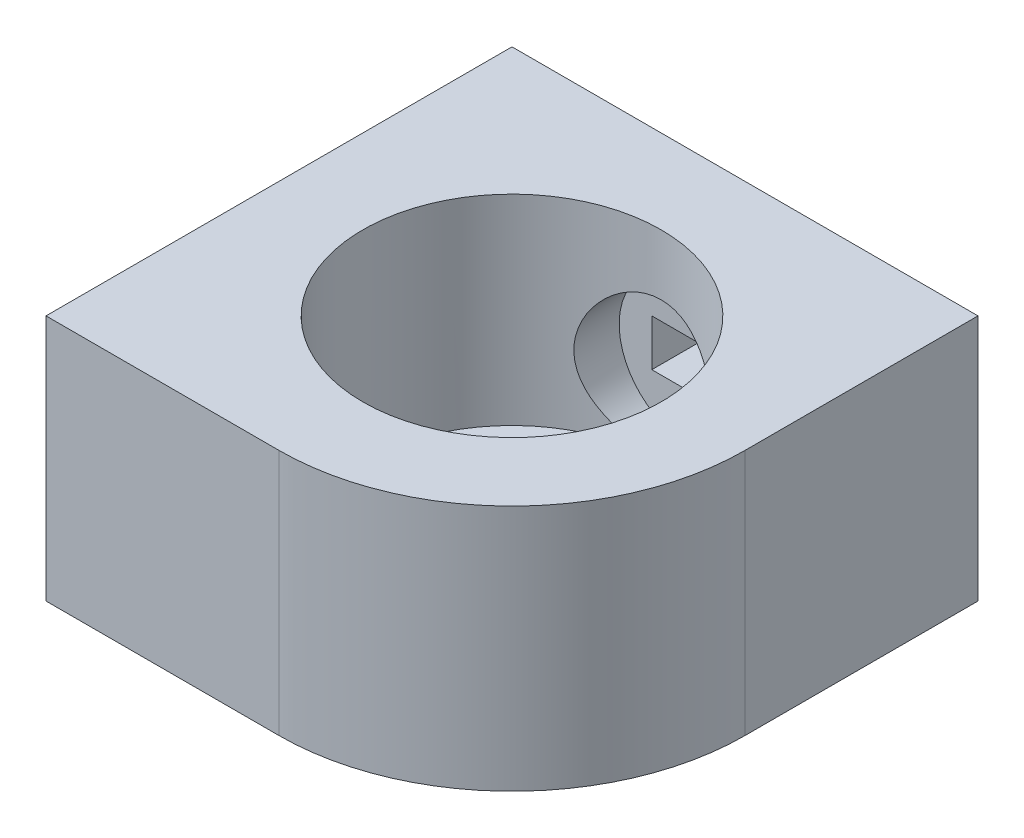
ISO-10303-21;
HEADER;
FILE_DESCRIPTION(('STEP AP214'),'2;1');
FILE_NAME('part.step','',(''),(''),'','','');
FILE_SCHEMA(('AUTOMOTIVE_DESIGN { 1 0 10303 214 1 1 1 1 }'));
ENDSEC;
DATA;
#1=APPLICATION_CONTEXT('core data for automotive mechanical design processes');
#2=APPLICATION_PROTOCOL_DEFINITION('international standard','automotive_design',2000,#1);
#3=PRODUCT_CONTEXT('',#1,'mechanical');
#4=PRODUCT('Part','Part','',(#3));
#5=PRODUCT_RELATED_PRODUCT_CATEGORY('part','',(#4));
#6=PRODUCT_DEFINITION_FORMATION('','',#4);
#7=PRODUCT_DEFINITION_CONTEXT('part definition',#1,'design');
#8=PRODUCT_DEFINITION('design','',#6,#7);
#9=PRODUCT_DEFINITION_SHAPE('','',#8);
#10=(LENGTH_UNIT() NAMED_UNIT(*) SI_UNIT(.MILLI.,.METRE.));
#11=(NAMED_UNIT(*) PLANE_ANGLE_UNIT() SI_UNIT($,.RADIAN.));
#12=(NAMED_UNIT(*) SI_UNIT($,.STERADIAN.) SOLID_ANGLE_UNIT());
#13=UNCERTAINTY_MEASURE_WITH_UNIT(LENGTH_MEASURE(1.E-05),#10,'distance_accuracy_value','');
#14=(GEOMETRIC_REPRESENTATION_CONTEXT(3) GLOBAL_UNCERTAINTY_ASSIGNED_CONTEXT((#13)) GLOBAL_UNIT_ASSIGNED_CONTEXT((#10,
#11,#12)) REPRESENTATION_CONTEXT('',''));
#15=CARTESIAN_POINT('',(0.,0.,0.));
#16=DIRECTION('',(0.,0.,1.));
#17=DIRECTION('',(1.,0.,0.));
#18=AXIS2_PLACEMENT_3D('',#15,#16,#17);
#19=CARTESIAN_POINT('',(0.,26.5,0.));
#20=DIRECTION('',(0.,-1.,0.));
#21=DIRECTION('',(0.,0.,-1.));
#22=AXIS2_PLACEMENT_3D('',#19,#20,#21);
#23=CYLINDRICAL_SURFACE('',#22,25.);
#24=CARTESIAN_POINT('',(0.,0.,0.));
#25=DIRECTION('',(0.,1.,0.));
#26=DIRECTION('',(0.,0.,1.));
#27=AXIS2_PLACEMENT_3D('',#24,#25,#26);
#28=CIRCLE('',#27,25.);
#29=CARTESIAN_POINT('',(0.,0.,25.));
#30=VERTEX_POINT('',#29);
#31=CARTESIAN_POINT('',(25.,0.,0.));
#32=VERTEX_POINT('',#31);
#33=EDGE_CURVE('E224',#30,#32,#28,.T.);
#34=ORIENTED_EDGE('',*,*,#33,.T.);
#35=DIRECTION('',(0.,-1.,0.));
#36=VECTOR('',#35,1.);
#37=CARTESIAN_POINT('',(25.,26.5,0.));
#38=LINE('',#37,#36);
#39=CARTESIAN_POINT('',(25.,26.5,0.));
#40=VERTEX_POINT('',#39);
#41=EDGE_CURVE('E227',#40,#32,#38,.T.);
#42=ORIENTED_EDGE('',*,*,#41,.F.);
#43=CARTESIAN_POINT('',(0.,26.5,0.));
#44=DIRECTION('',(0.,1.,0.));
#45=DIRECTION('',(0.,0.,1.));
#46=AXIS2_PLACEMENT_3D('',#43,#44,#45);
#47=CIRCLE('',#46,25.);
#48=CARTESIAN_POINT('',(0.,26.5,25.));
#49=VERTEX_POINT('',#48);
#50=EDGE_CURVE('E293',#49,#40,#47,.T.);
#51=ORIENTED_EDGE('',*,*,#50,.F.);
#52=DIRECTION('',(0.,-1.,0.));
#53=VECTOR('',#52,1.);
#54=CARTESIAN_POINT('',(0.,26.5,25.));
#55=LINE('',#54,#53);
#56=EDGE_CURVE('E229',#49,#30,#55,.T.);
#57=ORIENTED_EDGE('',*,*,#56,.T.);
#58=EDGE_LOOP('',(#34,#42,#51,#57));
#59=FACE_BOUND('',#58,.T.);
#60=ADVANCED_FACE('F45',(#59),#23,.T.);
#61=CARTESIAN_POINT('',(25.,26.5,0.));
#62=DIRECTION('',(1.,0.,0.));
#63=DIRECTION('',(0.,0.,-1.));
#64=AXIS2_PLACEMENT_3D('',#61,#62,#63);
#65=PLANE('',#64);
#66=DIRECTION('',(0.,0.,1.));
#67=VECTOR('',#66,1.);
#68=CARTESIAN_POINT('',(25.,0.,0.));
#69=LINE('',#68,#67);
#70=CARTESIAN_POINT('',(25.,0.,-25.));
#71=VERTEX_POINT('',#70);
#72=EDGE_CURVE('E234',#71,#32,#69,.T.);
#73=ORIENTED_EDGE('',*,*,#72,.F.);
#74=DIRECTION('',(0.,-1.,0.));
#75=VECTOR('',#74,1.);
#76=CARTESIAN_POINT('',(25.,26.5,-25.));
#77=LINE('',#76,#75);
#78=CARTESIAN_POINT('',(25.,26.5,-25.));
#79=VERTEX_POINT('',#78);
#80=EDGE_CURVE('E265',#79,#71,#77,.T.);
#81=ORIENTED_EDGE('',*,*,#80,.F.);
#82=DIRECTION('',(0.,0.,1.));
#83=VECTOR('',#82,1.);
#84=CARTESIAN_POINT('',(25.,26.5,0.));
#85=LINE('',#84,#83);
#86=EDGE_CURVE('E290',#79,#40,#85,.T.);
#87=ORIENTED_EDGE('',*,*,#86,.T.);
#88=ORIENTED_EDGE('',*,*,#41,.T.);
#89=EDGE_LOOP('',(#73,#81,#87,#88));
#90=FACE_BOUND('',#89,.T.);
#91=ADVANCED_FACE('F213',(#90),#65,.T.);
#92=CARTESIAN_POINT('',(0.,26.5,-25.));
#93=DIRECTION('',(0.,0.,-1.));
#94=DIRECTION('',(-1.,0.,0.));
#95=AXIS2_PLACEMENT_3D('',#92,#93,#94);
#96=PLANE('',#95);
#97=DIRECTION('',(0.,-1.,0.));
#98=VECTOR('',#97,1.);
#99=CARTESIAN_POINT('',(4.,26.5,-25.));
#100=LINE('',#99,#98);
#101=CARTESIAN_POINT('',(4.,15.,-25.));
#102=VERTEX_POINT('',#101);
#103=CARTESIAN_POINT('',(4.,10.,-25.));
#104=VERTEX_POINT('',#103);
#105=EDGE_CURVE('E11',#102,#104,#100,.T.);
#106=ORIENTED_EDGE('',*,*,#105,.F.);
#107=DIRECTION('',(1.,0.,0.));
#108=VECTOR('',#107,1.);
#109=CARTESIAN_POINT('',(0.,15.,-25.));
#110=LINE('',#109,#108);
#111=CARTESIAN_POINT('',(-4.,15.,-25.));
#112=VERTEX_POINT('',#111);
#113=EDGE_CURVE('E125',#112,#102,#110,.T.);
#114=ORIENTED_EDGE('',*,*,#113,.F.);
#115=DIRECTION('',(0.,1.,0.));
#116=VECTOR('',#115,1.);
#117=CARTESIAN_POINT('',(-4.,26.5,-25.));
#118=LINE('',#117,#116);
#119=CARTESIAN_POINT('',(-4.,10.,-25.));
#120=VERTEX_POINT('',#119);
#121=EDGE_CURVE('E276',#120,#112,#118,.T.);
#122=ORIENTED_EDGE('',*,*,#121,.F.);
#123=DIRECTION('',(-1.,0.,0.));
#124=VECTOR('',#123,1.);
#125=CARTESIAN_POINT('',(0.,10.,-25.));
#126=LINE('',#125,#124);
#127=EDGE_CURVE('E55',#104,#120,#126,.T.);
#128=ORIENTED_EDGE('',*,*,#127,.F.);
#129=EDGE_LOOP('',(#106,#114,#122,#128));
#130=FACE_BOUND('',#129,.T.);
#131=DIRECTION('',(1.,0.,0.));
#132=VECTOR('',#131,1.);
#133=CARTESIAN_POINT('',(0.,0.,-25.));
#134=LINE('',#133,#132);
#135=CARTESIAN_POINT('',(-25.,0.,-25.));
#136=VERTEX_POINT('',#135);
#137=EDGE_CURVE('E241',#136,#71,#134,.T.);
#138=ORIENTED_EDGE('',*,*,#137,.F.);
#139=DIRECTION('',(0.,-1.,0.));
#140=VECTOR('',#139,1.);
#141=CARTESIAN_POINT('',(-25.,26.5,-25.));
#142=LINE('',#141,#140);
#143=CARTESIAN_POINT('',(-25.,26.5,-25.));
#144=VERTEX_POINT('',#143);
#145=EDGE_CURVE('E262',#144,#136,#142,.T.);
#146=ORIENTED_EDGE('',*,*,#145,.F.);
#147=DIRECTION('',(1.,0.,0.));
#148=VECTOR('',#147,1.);
#149=CARTESIAN_POINT('',(0.,26.5,-25.));
#150=LINE('',#149,#148);
#151=EDGE_CURVE('E288',#144,#79,#150,.T.);
#152=ORIENTED_EDGE('',*,*,#151,.T.);
#153=ORIENTED_EDGE('',*,*,#80,.T.);
#154=EDGE_LOOP('',(#138,#146,#152,#153));
#155=FACE_BOUND('',#154,.T.);
#156=ADVANCED_FACE('F209',(#130,#155),#96,.T.);
#157=CARTESIAN_POINT('',(-25.,26.5,0.));
#158=DIRECTION('',(1.,0.,0.));
#159=DIRECTION('',(0.,0.,-1.));
#160=AXIS2_PLACEMENT_3D('',#157,#158,#159);
#161=PLANE('',#160);
#162=CARTESIAN_POINT('',(-25.,15.,0.));
#163=DIRECTION('',(-1.,0.,0.));
#164=DIRECTION('',(0.,0.,1.));
#165=AXIS2_PLACEMENT_3D('',#162,#163,#164);
#166=CIRCLE('',#165,2.55);
#167=CARTESIAN_POINT('',(-25.,15.,2.55));
#168=VERTEX_POINT('',#167);
#169=EDGE_CURVE('E168',#168,#168,#166,.T.);
#170=ORIENTED_EDGE('',*,*,#169,.F.);
#171=EDGE_LOOP('',(#170));
#172=FACE_BOUND('',#171,.T.);
#173=DIRECTION('',(0.,0.,1.));
#174=VECTOR('',#173,1.);
#175=CARTESIAN_POINT('',(-25.,0.,0.));
#176=LINE('',#175,#174);
#177=CARTESIAN_POINT('',(-25.,0.,25.));
#178=VERTEX_POINT('',#177);
#179=EDGE_CURVE('E245',#136,#178,#176,.T.);
#180=ORIENTED_EDGE('',*,*,#179,.T.);
#181=DIRECTION('',(0.,-1.,0.));
#182=VECTOR('',#181,1.);
#183=CARTESIAN_POINT('',(-25.,26.5,25.));
#184=LINE('',#183,#182);
#185=CARTESIAN_POINT('',(-25.,26.5,25.));
#186=VERTEX_POINT('',#185);
#187=EDGE_CURVE('E258',#186,#178,#184,.T.);
#188=ORIENTED_EDGE('',*,*,#187,.F.);
#189=DIRECTION('',(0.,0.,1.));
#190=VECTOR('',#189,1.);
#191=CARTESIAN_POINT('',(-25.,26.5,0.));
#192=LINE('',#191,#190);
#193=EDGE_CURVE('E298',#144,#186,#192,.T.);
#194=ORIENTED_EDGE('',*,*,#193,.F.);
#195=ORIENTED_EDGE('',*,*,#145,.T.);
#196=EDGE_LOOP('',(#180,#188,#194,#195));
#197=FACE_BOUND('',#196,.T.);
#198=ADVANCED_FACE('F206',(#172,#197),#161,.F.);
#199=CARTESIAN_POINT('',(0.,26.5,0.));
#200=DIRECTION('',(0.,-1.,0.));
#201=DIRECTION('',(0.,0.,-1.));
#202=AXIS2_PLACEMENT_3D('',#199,#200,#201);
#203=CYLINDRICAL_SURFACE('',#202,16.);
#204=CARTESIAN_POINT('',(0.,5.,0.));
#205=DIRECTION('',(0.,1.,0.));
#206=DIRECTION('',(0.,0.,1.));
#207=AXIS2_PLACEMENT_3D('',#204,#205,#206);
#208=CIRCLE('',#207,16.);
#209=CARTESIAN_POINT('',(0.,5.,-16.));
#210=VERTEX_POINT('',#209);
#211=EDGE_CURVE('E270',#210,#210,#208,.T.);
#212=ORIENTED_EDGE('',*,*,#211,.F.);
#213=CARTESIAN_POINT('',(0.,5.,-16.));
#214=CARTESIAN_POINT('',(0.198684978383708,5.00000133470156,-15.9999988460729));
#215=CARTESIAN_POINT('',(0.397405159506662,5.00790498937616,-15.9962898274929));
#216=CARTESIAN_POINT('',(0.793400942144659,5.03943702443244,-15.9815459475786));
#217=CARTESIAN_POINT('',(0.990675748558021,5.06307348606126,-15.9705073213562));
#218=CARTESIAN_POINT('',(1.38255568709545,5.12585725243969,-15.9413677841698));
#219=CARTESIAN_POINT('',(1.57715573407772,5.16503074904217,-15.923254948514));
#220=CARTESIAN_POINT('',(1.96202937856628,5.25847554537294,-15.8804267369559));
#221=CARTESIAN_POINT('',(2.15230117133312,5.31275302251288,-15.8557086597253));
#222=CARTESIAN_POINT('',(2.5263963430627,5.43558776768147,-15.8004090770488));
#223=CARTESIAN_POINT('',(2.7102432870351,5.50408459441996,-15.7698524316229));
#224=CARTESIAN_POINT('',(3.07128036340189,5.6548899995516,-15.7035329009397));
#225=CARTESIAN_POINT('',(3.24846793263279,5.73720383074645,-15.6677680363648));
#226=CARTESIAN_POINT('',(3.59505167550219,5.91490347424538,-15.5918903016855));
#227=CARTESIAN_POINT('',(3.76445252513566,6.01028130083434,-15.5517800908973));
#228=CARTESIAN_POINT('',(4.0947614575028,6.21346120320908,-15.4680966918296));
#229=CARTESIAN_POINT('',(4.25566640913768,6.32126781357084,-15.4245222414517));
#230=CARTESIAN_POINT('',(4.74156081488829,6.6747464942295,-15.2851193948765));
#231=CARTESIAN_POINT('',(5.05078627782166,6.9408061903006,-15.1848958698577));
#232=CARTESIAN_POINT('',(5.62207153793716,7.51926467332938,-14.9828038505899));
#233=CARTESIAN_POINT('',(5.88409999381398,7.83169400288141,-14.880934311862));
#234=CARTESIAN_POINT('',(6.24512338342805,8.3411924792818,-14.7314953708042));
#235=CARTESIAN_POINT('',(6.36315781139047,8.52410197020838,-14.6807602413845));
#236=CARTESIAN_POINT('',(6.58327002412669,8.90027882502379,-14.5833817469594));
#237=CARTESIAN_POINT('',(6.68535444665198,9.09354183498645,-14.5367366833983));
#238=CARTESIAN_POINT('',(6.87264982698682,9.48925315698424,-14.4491309094692));
#239=CARTESIAN_POINT('',(6.95786521609918,9.69169903956227,-14.4081687071264));
#240=CARTESIAN_POINT('',(7.11054360778505,10.1044684143595,-14.3334365571153));
#241=CARTESIAN_POINT('',(7.17800832776723,10.314791142229,-14.2996659137112));
#242=CARTESIAN_POINT('',(7.29107295220363,10.7297265334233,-14.2423329622815));
#243=CARTESIAN_POINT('',(7.33768649732503,10.9339984141371,-14.2183045417657));
#244=CARTESIAN_POINT('',(7.41373780413886,11.3465382051588,-14.1787988507063));
#245=CARTESIAN_POINT('',(7.44317621865973,11.5548059632722,-14.1633212551462));
#246=CARTESIAN_POINT('',(7.4844449105051,11.973417068694,-14.1415569007441));
#247=CARTESIAN_POINT('',(7.49628712066956,12.1837589119344,-14.1352639134251));
#248=CARTESIAN_POINT('',(7.50222194138465,12.6047560606178,-14.1321152706661));
#249=CARTESIAN_POINT('',(7.49631590780841,12.815411340887,-14.1352588943183));
#250=CARTESIAN_POINT('',(7.4683591847244,13.2136459083658,-14.1500465849328));
#251=CARTESIAN_POINT('',(7.44802112924433,13.4013821922175,-14.1607885647231));
#252=CARTESIAN_POINT('',(7.39335102490061,13.7743182890583,-14.1894084821447));
#253=CARTESIAN_POINT('',(7.35901427544551,13.959517228426,-14.2072888167068));
#254=CARTESIAN_POINT('',(7.27673015248413,14.3260550260998,-14.2496081512079));
#255=CARTESIAN_POINT('',(7.22878524329657,14.5073945769217,-14.2740459636012));
#256=CARTESIAN_POINT('',(7.11973671519658,14.8652382243252,-14.3287496621749));
#257=CARTESIAN_POINT('',(7.05862796473205,15.0417404048626,-14.359017820663));
#258=CARTESIAN_POINT('',(6.92226595782545,15.3928362156327,-14.4252592735024));
#259=CARTESIAN_POINT('',(6.84672338987839,15.5672958162029,-14.4613463708806));
#260=CARTESIAN_POINT('',(6.68301435722466,15.9092925218971,-14.5377259676581));
#261=CARTESIAN_POINT('',(6.59484366991334,16.0768272872436,-14.5780198725078));
#262=CARTESIAN_POINT('',(6.40647498952891,16.4041962468056,-14.6617768627162));
#263=CARTESIAN_POINT('',(6.30627493817616,16.564029116616,-14.7052404899281));
#264=CARTESIAN_POINT('',(6.09443533093958,16.8753064509593,-14.7942914525017));
#265=CARTESIAN_POINT('',(5.98279496409667,17.0267503196549,-14.8398789382904));
#266=CARTESIAN_POINT('',(5.73576038327544,17.3367899494433,-14.937220494941));
#267=CARTESIAN_POINT('',(5.59910402609406,17.494342192968,-14.9891016128366));
#268=CARTESIAN_POINT('',(5.31319126171736,17.7974900808866,-15.0928167361417));
#269=CARTESIAN_POINT('',(5.16393821723144,17.9430888959248,-15.1446507504143));
#270=CARTESIAN_POINT('',(4.85345036427314,18.2216737986565,-15.2469916216883));
#271=CARTESIAN_POINT('',(4.69220683181821,18.3546505395025,-15.2974974754636));
#272=CARTESIAN_POINT('',(4.3587257803499,18.6069805724052,-15.3958343550306));
#273=CARTESIAN_POINT('',(4.18649266397653,18.7263392673434,-15.4436664377568));
#274=CARTESIAN_POINT('',(3.82534897437882,18.9547668668391,-15.5371411424123));
#275=CARTESIAN_POINT('',(3.63605782899515,19.0632950529125,-15.5826382921659));
#276=CARTESIAN_POINT('',(3.247829788707,19.2638235884181,-15.6681551582731));
#277=CARTESIAN_POINT('',(3.04889722184982,19.35583126824,-15.7081773020802));
#278=CARTESIAN_POINT('',(2.64273954513623,19.5223988400337,-15.7815872413646));
#279=CARTESIAN_POINT('',(2.43551714256241,19.5969643746364,-15.8149771818675));
#280=CARTESIAN_POINT('',(2.01431837496808,19.727803123287,-15.8741213201554));
#281=CARTESIAN_POINT('',(1.80034268327319,19.7840781546783,-15.8998762765294));
#282=CARTESIAN_POINT('',(1.3838416342024,19.8740680546083,-15.9413115085215));
#283=CARTESIAN_POINT('',(1.1816760670069,19.9091685086244,-15.9576069653574));
#284=CARTESIAN_POINT('',(0.774682525815466,19.9627063246666,-15.9825348793092));
#285=CARTESIAN_POINT('',(0.569854685606537,19.981144520761,-15.991167719995));
#286=CARTESIAN_POINT('',(0.159265388623443,20.0011244636554,-16.0005247004508));
#287=CARTESIAN_POINT('',(-0.0464957330168185,20.0026718590077,-16.0012514841317));
#288=CARTESIAN_POINT('',(-0.457320832895425,19.9888647156134,-15.994782158623));
#289=CARTESIAN_POINT('',(-0.662384834944512,19.9735107600858,-15.987586322821));
#290=CARTESIAN_POINT('',(-1.05657624474016,19.9276756949274,-15.966213997459));
#291=CARTESIAN_POINT('',(-1.24585675746878,19.8982681889996,-15.9525334270816));
#292=CARTESIAN_POINT('',(-1.62113071196638,19.8251954949838,-15.9187762864131));
#293=CARTESIAN_POINT('',(-1.80712300301925,19.7815254158782,-15.8986975220678));
#294=CARTESIAN_POINT('',(-2.17449381590771,19.68038066569,-15.8526288678564));
#295=CARTESIAN_POINT('',(-2.35587375707316,19.6229102995533,-15.8266408215019));
#296=CARTESIAN_POINT('',(-2.71306993562593,19.4946606617722,-15.7693369264515));
#297=CARTESIAN_POINT('',(-2.8888839800483,19.4238762187827,-15.7380190080216));
#298=CARTESIAN_POINT('',(-3.23912592194566,19.2672715481848,-15.6697431345515));
#299=CARTESIAN_POINT('',(-3.41335209461966,19.181062234352,-15.6326435655726));
#300=CARTESIAN_POINT('',(-3.75394929679052,18.995803507234,-15.5543696093481));
#301=CARTESIAN_POINT('',(-3.92031762818516,18.896749726719,-15.5131938372899));
#302=CARTESIAN_POINT('',(-4.24436986100939,18.6864882590567,-15.4276833030028));
#303=CARTESIAN_POINT('',(-4.40205220331746,18.5752784005346,-15.3833479768937));
#304=CARTESIAN_POINT('',(-4.70800134309142,18.3413874243619,-15.2924881874709));
#305=CARTESIAN_POINT('',(-4.8562675287667,18.218705562625,-15.2459635822556));
#306=CARTESIAN_POINT('',(-5.15545198362046,17.9511539982813,-15.1475497207123));
#307=CARTESIAN_POINT('',(-5.30543871289511,17.8052814522686,-15.0955506936582));
#308=CARTESIAN_POINT('',(-5.59266039605666,17.5015820770988,-14.991513566763));
#309=CARTESIAN_POINT('',(-5.72989888883985,17.343758587726,-14.9394754818322));
#310=CARTESIAN_POINT('',(-5.99099156137099,17.0168357879838,-14.8367016916039));
#311=CARTESIAN_POINT('',(-6.11483773955027,16.8477298331184,-14.7859667785691));
#312=CARTESIAN_POINT('',(-6.34828789069091,16.4991557852131,-14.6872498685437));
#313=CARTESIAN_POINT('',(-6.45788996752596,16.3196863172007,-14.6392682385347));
#314=CARTESIAN_POINT('',(-6.66546985674085,15.9451245423081,-14.5459581877502));
#315=CARTESIAN_POINT('',(-6.76293178369181,15.7497096280189,-14.5007735713545));
#316=CARTESIAN_POINT('',(-6.94080032576569,15.3501039993575,-14.416482976866));
#317=CARTESIAN_POINT('',(-7.02121506267237,15.1459175200353,-14.3773741064922));
#318=CARTESIAN_POINT('',(-7.16410018214971,14.7302317223504,-14.3067126210842));
#319=CARTESIAN_POINT('',(-7.22658268879367,14.5187374537265,-14.2751549030884));
#320=CARTESIAN_POINT('',(-7.33284831121284,14.0899976377978,-14.2208618179412));
#321=CARTESIAN_POINT('',(-7.37663387603153,13.8727528476939,-14.1981252953696));
#322=CARTESIAN_POINT('',(-7.44177052488512,13.4543254002257,-14.1640837962867));
#323=CARTESIAN_POINT('',(-7.46479499917719,13.2534711131606,-14.1519296332854));
#324=CARTESIAN_POINT('',(-7.49454494489792,12.8502265079046,-14.1361977073943));
#325=CARTESIAN_POINT('',(-7.50127144771227,12.6478362877255,-14.1326194017981));
#326=CARTESIAN_POINT('',(-7.49833322871385,12.243262143296,-14.1341784280198));
#327=CARTESIAN_POINT('',(-7.48867258798825,12.0410781802257,-14.1393135898183));
#328=CARTESIAN_POINT('',(-7.45310170827637,11.6385503267369,-14.1580958480198));
#329=CARTESIAN_POINT('',(-7.42719187157108,11.4382063908894,-14.1717427336982));
#330=CARTESIAN_POINT('',(-7.36199567648757,11.0557697777293,-14.2057120812356));
#331=CARTESIAN_POINT('',(-7.32385012562808,10.8734296439382,-14.2254612413866));
#332=CARTESIAN_POINT('',(-7.23432363159499,10.51276670086,-14.2711978059801));
#333=CARTESIAN_POINT('',(-7.18293821445399,10.3344452717529,-14.2971873189373));
#334=CARTESIAN_POINT('',(-7.06742914896321,9.98292405647278,-14.3546368818265));
#335=CARTESIAN_POINT('',(-7.00330739008241,9.80972351497644,-14.3860961202245));
#336=CARTESIAN_POINT('',(-6.86282289946018,9.46922493819935,-14.4536408895681));
#337=CARTESIAN_POINT('',(-6.7864554485788,9.30192920891339,-14.4897282029637));
#338=CARTESIAN_POINT('',(-6.61660733291926,8.96323192032883,-14.5681096966101));
#339=CARTESIAN_POINT('',(-6.52232973832439,8.79228840875854,-14.610656357192));
#340=CARTESIAN_POINT('',(-6.32111720794214,8.45878453351891,-14.6988279531691));
#341=CARTESIAN_POINT('',(-6.21417794253295,8.29622706487129,-14.7444539392242));
#342=CARTESIAN_POINT('',(-5.98827132182057,7.98022824541952,-14.8376391569387));
#343=CARTESIAN_POINT('',(-5.86930123732465,7.82678897566983,-14.8851988257846));
#344=CARTESIAN_POINT('',(-5.61996391618704,7.52972689084175,-14.9811164178737));
#345=CARTESIAN_POINT('',(-5.48959596172181,7.38610469504678,-15.0294743912372));
#346=CARTESIAN_POINT('',(-5.20422446267076,7.09521695120401,-15.1308044337945));
#347=CARTESIAN_POINT('',(-5.04806429358375,6.94907215234134,-15.1837444079016));
#348=CARTESIAN_POINT('',(-4.723538845546,6.67042820593642,-15.2878123638838));
#349=CARTESIAN_POINT('',(-4.5551773908853,6.53792481397137,-15.3389409061053));
#350=CARTESIAN_POINT('',(-4.20694413357842,6.28729689554179,-15.4380834206248));
#351=CARTESIAN_POINT('',(-4.02706172440493,6.16918591809874,-15.4860944385284));
#352=CARTESIAN_POINT('',(-3.65703813436837,5.9484769735082,-15.5776240989416));
#353=CARTESIAN_POINT('',(-3.46690174450895,5.84587184526873,-15.6211448122516));
#354=CARTESIAN_POINT('',(-3.0782828220304,5.65744116065697,-15.7023377481207));
#355=CARTESIAN_POINT('',(-2.87983796781283,5.57154810989802,-15.7400333636279));
#356=CARTESIAN_POINT('',(-2.47533267155923,5.416951347954,-15.8086931946041));
#357=CARTESIAN_POINT('',(-2.26927599167237,5.34823927214714,-15.8396606847197));
#358=CARTESIAN_POINT('',(-1.85152677736764,5.22889746235288,-15.8939017494539));
#359=CARTESIAN_POINT('',(-1.63984848047463,5.17822600368025,-15.9171930682654));
#360=CARTESIAN_POINT('',(-1.21226253273045,5.09542133106038,-15.9554513597475));
#361=CARTESIAN_POINT('',(-0.996357766954256,5.06327589782251,-15.9704238190895));
#362=CARTESIAN_POINT('',(-0.649979618846135,5.02708535990301,-15.9873176617654));
#363=CARTESIAN_POINT('',(-0.52024745725762,5.01693398125844,-15.9920681097932));
#364=CARTESIAN_POINT('',(-0.260348574031564,5.00339079409464,-15.9984096896417));
#365=CARTESIAN_POINT('',(-0.130181843455646,4.99999912548039,-16.000000756073));
#366=CARTESIAN_POINT('',(0.,5.,-16.));
#367=B_SPLINE_CURVE_WITH_KNOTS('',3,(#213,#214,#215,#216,#217,#218,#219,#220,#221,#222,#223,
#224,#225,#226,#227,#228,#229,#230,#231,#232,#233,#234,#235,#236,#237,#238,#239,#240,#241,#242,
#243,#244,#245,#246,#247,#248,#249,#250,#251,#252,#253,#254,#255,#256,#257,#258,#259,#260,#261,
#262,#263,#264,#265,#266,#267,#268,#269,#270,#271,#272,#273,#274,#275,#276,#277,#278,#279,#280,
#281,#282,#283,#284,#285,#286,#287,#288,#289,#290,#291,#292,#293,#294,#295,#296,#297,#298,#299,
#300,#301,#302,#303,#304,#305,#306,#307,#308,#309,#310,#311,#312,#313,#314,#315,#316,#317,#318,
#319,#320,#321,#322,#323,#324,#325,#326,#327,#328,#329,#330,#331,#332,#333,#334,#335,#336,#337,
#338,#339,#340,#341,#342,#343,#344,#345,#346,#347,#348,#349,#350,#351,#352,#353,#354,#355,#356,
#357,#358,#359,#360,#361,#362,#363,#364,#365,#366),.UNSPECIFIED.,.T.,.F.,(4,2,2,2,2,2,2,2,2,2,2,
2,2,2,2,2,2,2,2,2,2,2,2,2,2,2,2,2,2,2,2,2,2,2,2,2,2,2,2,2,2,2,2,2,2,2,2,2,2,2,2,2,2,2,2,2,2,2,2,
2,2,2,2,2,2,2,2,2,2,2,2,2,2,2,2,2,4),(0.,0.595925420003683,1.19215717700225,1.78939834445234,
2.38688413886008,2.98188041544549,3.57710340582304,4.17196416071094,4.76704263835342,
6.02156823421918,7.27692385450074,7.94677292957689,8.61634249358411,9.28573593521211,
9.95506458800325,10.5868743235641,11.2186600424091,11.8500171208532,12.48132596814,
13.0480800292395,13.6150245564226,14.1818664803439,14.7489297727587,15.3288514367214,
15.9089674702399,16.4891829061354,17.0694394997145,17.7134745065489,18.3573381275588,
19.001674879741,19.6457550994771,20.3135514446096,20.9810507425498,21.6483338011915,
22.315550538345,22.9322463906151,23.5489113710228,24.1653701225412,24.7818076024397,
25.3572610045308,25.9329119525374,26.5083835612147,27.0840791531896,27.6771374195194,
28.2703978621337,28.8637644493766,29.4571695497328,30.1032163893838,30.7490833478189,
31.3953340877694,32.0416707664964,32.7097778980581,33.3775660047509,34.044901547062,
34.7121496507176,35.3189343091107,35.9256805673039,36.5322757423727,37.1388559005701,
37.7002299814071,38.2617940090862,38.8232747894404,39.3849724707816,39.9837513310078,
40.5827355365042,41.1818559277595,41.7810140780825,42.4412425716785,43.1012650152463,
43.7619040809183,44.4222371039722,45.0798452361286,45.7371325831898,46.3928897140806,
47.0482138279405,47.4386664166666,47.8291270864629),.UNSPECIFIED.);
#368=EDGE_CURVE('E161',#210,#210,#367,.T.);
#369=ORIENTED_EDGE('',*,*,#368,.F.);
#370=EDGE_LOOP('',(#212,#369));
#371=FACE_BOUND('',#370,.T.);
#372=CARTESIAN_POINT('',(0.,26.5,0.));
#373=DIRECTION('',(0.,1.,0.));
#374=DIRECTION('',(0.,0.,1.));
#375=AXIS2_PLACEMENT_3D('',#372,#373,#374);
#376=CIRCLE('',#375,16.);
#377=CARTESIAN_POINT('',(0.,26.5,16.));
#378=VERTEX_POINT('',#377);
#379=EDGE_CURVE('E255',#378,#378,#376,.T.);
#380=ORIENTED_EDGE('',*,*,#379,.T.);
#381=EDGE_LOOP('',(#380));
#382=FACE_BOUND('',#381,.T.);
#383=ADVANCED_FACE('F47',(#371,#382),#203,.F.);
#384=CARTESIAN_POINT('',(0.,26.5,25.));
#385=DIRECTION('',(0.,0.,1.));
#386=DIRECTION('',(1.,0.,0.));
#387=AXIS2_PLACEMENT_3D('',#384,#385,#386);
#388=PLANE('',#387);
#389=DIRECTION('',(-1.,0.,0.));
#390=VECTOR('',#389,1.);
#391=CARTESIAN_POINT('',(0.,0.,25.));
#392=LINE('',#391,#390);
#393=EDGE_CURVE('E252',#30,#178,#392,.T.);
#394=ORIENTED_EDGE('',*,*,#393,.F.);
#395=ORIENTED_EDGE('',*,*,#56,.F.);
#396=DIRECTION('',(-1.,0.,0.));
#397=VECTOR('',#396,1.);
#398=CARTESIAN_POINT('',(0.,26.5,25.));
#399=LINE('',#398,#397);
#400=EDGE_CURVE('E259',#49,#186,#399,.T.);
#401=ORIENTED_EDGE('',*,*,#400,.T.);
#402=ORIENTED_EDGE('',*,*,#187,.T.);
#403=EDGE_LOOP('',(#394,#395,#401,#402));
#404=FACE_BOUND('',#403,.T.);
#405=ADVANCED_FACE('F198',(#404),#388,.T.);
#406=CARTESIAN_POINT('',(0.,26.5,0.));
#407=DIRECTION('',(0.,1.,0.));
#408=DIRECTION('',(0.,0.,1.));
#409=AXIS2_PLACEMENT_3D('',#406,#407,#408);
#410=PLANE('',#409);
#411=ORIENTED_EDGE('',*,*,#379,.F.);
#412=EDGE_LOOP('',(#411));
#413=FACE_BOUND('',#412,.T.);
#414=ORIENTED_EDGE('',*,*,#50,.T.);
#415=ORIENTED_EDGE('',*,*,#86,.F.);
#416=ORIENTED_EDGE('',*,*,#151,.F.);
#417=ORIENTED_EDGE('',*,*,#193,.T.);
#418=ORIENTED_EDGE('',*,*,#400,.F.);
#419=EDGE_LOOP('',(#414,#415,#416,#417,#418));
#420=FACE_BOUND('',#419,.T.);
#421=ADVANCED_FACE('F195',(#413,#420),#410,.T.);
#422=CARTESIAN_POINT('',(0.,0.,0.));
#423=DIRECTION('',(0.,1.,0.));
#424=DIRECTION('',(0.,0.,1.));
#425=AXIS2_PLACEMENT_3D('',#422,#423,#424);
#426=PLANE('',#425);
#427=CARTESIAN_POINT('',(0.,0.,0.));
#428=DIRECTION('',(0.,1.,0.));
#429=DIRECTION('',(0.,0.,1.));
#430=AXIS2_PLACEMENT_3D('',#427,#428,#429);
#431=CIRCLE('',#430,2.);
#432=CARTESIAN_POINT('',(0.,0.,2.));
#433=VERTEX_POINT('',#432);
#434=EDGE_CURVE('E235',#433,#433,#431,.T.);
#435=ORIENTED_EDGE('',*,*,#434,.T.);
#436=EDGE_LOOP('',(#435));
#437=FACE_BOUND('',#436,.T.);
#438=ORIENTED_EDGE('',*,*,#33,.F.);
#439=ORIENTED_EDGE('',*,*,#393,.T.);
#440=ORIENTED_EDGE('',*,*,#179,.F.);
#441=ORIENTED_EDGE('',*,*,#137,.T.);
#442=ORIENTED_EDGE('',*,*,#72,.T.);
#443=EDGE_LOOP('',(#438,#439,#440,#441,#442));
#444=FACE_BOUND('',#443,.T.);
#445=ADVANCED_FACE('F193',(#437,#444),#426,.F.);
#446=CARTESIAN_POINT('',(0.,5.,0.));
#447=DIRECTION('',(0.,1.,0.));
#448=DIRECTION('',(0.,0.,1.));
#449=AXIS2_PLACEMENT_3D('',#446,#447,#448);
#450=PLANE('',#449);
#451=CARTESIAN_POINT('',(0.,5.,0.));
#452=DIRECTION('',(0.,1.,0.));
#453=DIRECTION('',(0.,0.,1.));
#454=AXIS2_PLACEMENT_3D('',#451,#452,#453);
#455=CIRCLE('',#454,2.);
#456=CARTESIAN_POINT('',(0.,5.,2.));
#457=VERTEX_POINT('',#456);
#458=EDGE_CURVE('E311',#457,#457,#455,.T.);
#459=ORIENTED_EDGE('',*,*,#458,.F.);
#460=EDGE_LOOP('',(#459));
#461=FACE_BOUND('',#460,.T.);
#462=ORIENTED_EDGE('',*,*,#211,.T.);
#463=EDGE_LOOP('',(#462));
#464=FACE_BOUND('',#463,.T.);
#465=ADVANCED_FACE('F189',(#461,#464),#450,.T.);
#466=CARTESIAN_POINT('',(0.,0.,0.));
#467=DIRECTION('',(0.,1.,0.));
#468=DIRECTION('',(0.,0.,1.));
#469=AXIS2_PLACEMENT_3D('',#466,#467,#468);
#470=CYLINDRICAL_SURFACE('',#469,2.);
#471=ORIENTED_EDGE('',*,*,#434,.F.);
#472=EDGE_LOOP('',(#471));
#473=FACE_BOUND('',#472,.T.);
#474=ORIENTED_EDGE('',*,*,#458,.T.);
#475=EDGE_LOOP('',(#474));
#476=FACE_BOUND('',#475,.T.);
#477=ADVANCED_FACE('F185',(#473,#476),#470,.F.);
#478=CARTESIAN_POINT('',(-20.,15.,0.));
#479=DIRECTION('',(-1.,0.,0.));
#480=DIRECTION('',(0.,0.,1.));
#481=AXIS2_PLACEMENT_3D('',#478,#479,#480);
#482=CYLINDRICAL_SURFACE('',#481,2.55);
#483=CARTESIAN_POINT('',(-20.,15.,0.));
#484=DIRECTION('',(-1.,0.,0.));
#485=DIRECTION('',(0.,0.,1.));
#486=AXIS2_PLACEMENT_3D('',#483,#484,#485);
#487=CIRCLE('',#486,2.55);
#488=CARTESIAN_POINT('',(-20.,15.,2.55));
#489=VERTEX_POINT('',#488);
#490=EDGE_CURVE('E169',#489,#489,#487,.T.);
#491=ORIENTED_EDGE('',*,*,#490,.F.);
#492=EDGE_LOOP('',(#491));
#493=FACE_BOUND('',#492,.T.);
#494=ORIENTED_EDGE('',*,*,#169,.T.);
#495=EDGE_LOOP('',(#494));
#496=FACE_BOUND('',#495,.T.);
#497=ADVANCED_FACE('F181',(#493,#496),#482,.F.);
#498=CARTESIAN_POINT('',(-20.,15.,0.));
#499=DIRECTION('',(-1.,0.,0.));
#500=DIRECTION('',(0.,0.,1.));
#501=AXIS2_PLACEMENT_3D('',#498,#499,#500);
#502=PLANE('',#501);
#503=ORIENTED_EDGE('',*,*,#490,.T.);
#504=EDGE_LOOP('',(#503));
#505=FACE_BOUND('',#504,.T.);
#506=ADVANCED_FACE('F176',(#505),#502,.T.);
#507=CARTESIAN_POINT('',(0.,12.5,-19.));
#508=DIRECTION('',(0.,0.,1.));
#509=DIRECTION('',(1.,0.,0.));
#510=AXIS2_PLACEMENT_3D('',#507,#508,#509);
#511=CYLINDRICAL_SURFACE('',#510,7.5);
#512=ORIENTED_EDGE('',*,*,#368,.T.);
#513=EDGE_LOOP('',(#512));
#514=FACE_BOUND('',#513,.T.);
#515=CARTESIAN_POINT('',(0.,12.5,-19.));
#516=DIRECTION('',(0.,0.,1.));
#517=DIRECTION('',(1.,0.,0.));
#518=AXIS2_PLACEMENT_3D('',#515,#516,#517);
#519=CIRCLE('',#518,7.5);
#520=CARTESIAN_POINT('',(7.5,12.5,-19.));
#521=VERTEX_POINT('',#520);
#522=EDGE_CURVE('E152',#521,#521,#519,.T.);
#523=ORIENTED_EDGE('',*,*,#522,.F.);
#524=EDGE_LOOP('',(#523));
#525=FACE_BOUND('',#524,.T.);
#526=ADVANCED_FACE('F171',(#514,#525),#511,.F.);
#527=CARTESIAN_POINT('',(0.,12.5,-19.));
#528=DIRECTION('',(0.,0.,1.));
#529=DIRECTION('',(1.,0.,0.));
#530=AXIS2_PLACEMENT_3D('',#527,#528,#529);
#531=PLANE('',#530);
#532=DIRECTION('',(0.,1.,0.));
#533=VECTOR('',#532,1.);
#534=CARTESIAN_POINT('',(4.,10.,-19.));
#535=LINE('',#534,#533);
#536=CARTESIAN_POINT('',(4.,10.,-19.));
#537=VERTEX_POINT('',#536);
#538=CARTESIAN_POINT('',(4.,15.,-19.));
#539=VERTEX_POINT('',#538);
#540=EDGE_CURVE('E132',#537,#539,#535,.T.);
#541=ORIENTED_EDGE('',*,*,#540,.F.);
#542=DIRECTION('',(1.,0.,0.));
#543=VECTOR('',#542,1.);
#544=CARTESIAN_POINT('',(-4.,10.,-19.));
#545=LINE('',#544,#543);
#546=CARTESIAN_POINT('',(-4.,10.,-19.));
#547=VERTEX_POINT('',#546);
#548=EDGE_CURVE('E129',#547,#537,#545,.T.);
#549=ORIENTED_EDGE('',*,*,#548,.F.);
#550=DIRECTION('',(0.,-1.,0.));
#551=VECTOR('',#550,1.);
#552=CARTESIAN_POINT('',(-4.,10.,-19.));
#553=LINE('',#552,#551);
#554=CARTESIAN_POINT('',(-4.,15.,-19.));
#555=VERTEX_POINT('',#554);
#556=EDGE_CURVE('E62',#555,#547,#553,.T.);
#557=ORIENTED_EDGE('',*,*,#556,.F.);
#558=DIRECTION('',(-1.,0.,0.));
#559=VECTOR('',#558,1.);
#560=CARTESIAN_POINT('',(-4.,15.,-19.));
#561=LINE('',#560,#559);
#562=EDGE_CURVE('E123',#539,#555,#561,.T.);
#563=ORIENTED_EDGE('',*,*,#562,.F.);
#564=EDGE_LOOP('',(#541,#549,#557,#563));
#565=FACE_BOUND('',#564,.T.);
#566=ORIENTED_EDGE('',*,*,#522,.T.);
#567=EDGE_LOOP('',(#566));
#568=FACE_BOUND('',#567,.T.);
#569=ADVANCED_FACE('F141',(#565,#568),#531,.T.);
#570=CARTESIAN_POINT('',(4.,10.,-38.));
#571=DIRECTION('',(1.,0.,0.));
#572=DIRECTION('',(0.,0.,-1.));
#573=AXIS2_PLACEMENT_3D('',#570,#571,#572);
#574=PLANE('',#573);
#575=ORIENTED_EDGE('',*,*,#105,.T.);
#576=DIRECTION('',(0.,0.,1.));
#577=VECTOR('',#576,1.);
#578=CARTESIAN_POINT('',(4.,10.,-38.));
#579=LINE('',#578,#577);
#580=EDGE_CURVE('E135',#104,#537,#579,.T.);
#581=ORIENTED_EDGE('',*,*,#580,.T.);
#582=ORIENTED_EDGE('',*,*,#540,.T.);
#583=DIRECTION('',(0.,0.,1.));
#584=VECTOR('',#583,1.);
#585=CARTESIAN_POINT('',(4.,15.,-38.));
#586=LINE('',#585,#584);
#587=EDGE_CURVE('E119',#102,#539,#586,.T.);
#588=ORIENTED_EDGE('',*,*,#587,.F.);
#589=EDGE_LOOP('',(#575,#581,#582,#588));
#590=FACE_BOUND('',#589,.T.);
#591=ADVANCED_FACE('F133',(#590),#574,.F.);
#592=CARTESIAN_POINT('',(-4.,10.,-38.));
#593=DIRECTION('',(0.,-1.,0.));
#594=DIRECTION('',(0.,0.,-1.));
#595=AXIS2_PLACEMENT_3D('',#592,#593,#594);
#596=PLANE('',#595);
#597=ORIENTED_EDGE('',*,*,#127,.T.);
#598=DIRECTION('',(0.,0.,1.));
#599=VECTOR('',#598,1.);
#600=CARTESIAN_POINT('',(-4.,10.,-38.));
#601=LINE('',#600,#599);
#602=EDGE_CURVE('E153',#120,#547,#601,.T.);
#603=ORIENTED_EDGE('',*,*,#602,.T.);
#604=ORIENTED_EDGE('',*,*,#548,.T.);
#605=ORIENTED_EDGE('',*,*,#580,.F.);
#606=EDGE_LOOP('',(#597,#603,#604,#605));
#607=FACE_BOUND('',#606,.T.);
#608=ADVANCED_FACE('F281',(#607),#596,.F.);
#609=CARTESIAN_POINT('',(-4.,10.,-38.));
#610=DIRECTION('',(-1.,0.,0.));
#611=DIRECTION('',(0.,0.,1.));
#612=AXIS2_PLACEMENT_3D('',#609,#610,#611);
#613=PLANE('',#612);
#614=ORIENTED_EDGE('',*,*,#121,.T.);
#615=DIRECTION('',(0.,0.,1.));
#616=VECTOR('',#615,1.);
#617=CARTESIAN_POINT('',(-4.,15.,-38.));
#618=LINE('',#617,#616);
#619=EDGE_CURVE('E69',#112,#555,#618,.T.);
#620=ORIENTED_EDGE('',*,*,#619,.T.);
#621=ORIENTED_EDGE('',*,*,#556,.T.);
#622=ORIENTED_EDGE('',*,*,#602,.F.);
#623=EDGE_LOOP('',(#614,#620,#621,#622));
#624=FACE_BOUND('',#623,.T.);
#625=ADVANCED_FACE('F283',(#624),#613,.F.);
#626=CARTESIAN_POINT('',(-4.,15.,-38.));
#627=DIRECTION('',(0.,1.,0.));
#628=DIRECTION('',(0.,0.,1.));
#629=AXIS2_PLACEMENT_3D('',#626,#627,#628);
#630=PLANE('',#629);
#631=ORIENTED_EDGE('',*,*,#113,.T.);
#632=ORIENTED_EDGE('',*,*,#587,.T.);
#633=ORIENTED_EDGE('',*,*,#562,.T.);
#634=ORIENTED_EDGE('',*,*,#619,.F.);
#635=EDGE_LOOP('',(#631,#632,#633,#634));
#636=FACE_BOUND('',#635,.T.);
#637=ADVANCED_FACE('F121',(#636),#630,.F.);
#638=CLOSED_SHELL('',(#60,#91,#156,#198,#383,#405,#421,#445,#465,#477,#497,#506,#526,#569,#591,
#608,#625,#637));
#639=MANIFOLD_SOLID_BREP('B2',#638);
#640=ADVANCED_BREP_SHAPE_REPRESENTATION('',(#18,#639),#14);
#641=SHAPE_DEFINITION_REPRESENTATION(#9,#640);
ENDSEC;
END-ISO-10303-21;
